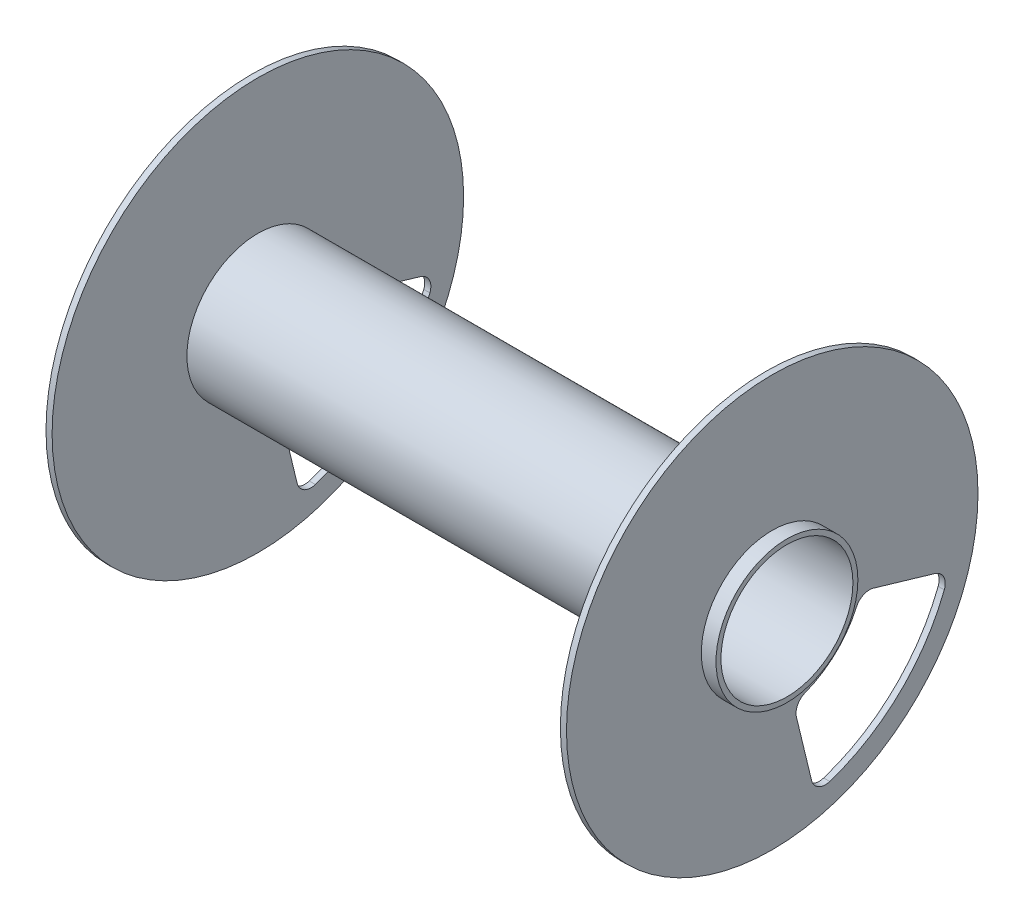
ISO-10303-21;
HEADER;
FILE_DESCRIPTION(('STEP AP214'),'2;1');
FILE_NAME('part.step','',(''),(''),'','','');
FILE_SCHEMA(('AUTOMOTIVE_DESIGN { 1 0 10303 214 1 1 1 1 }'));
ENDSEC;
DATA;
#1=APPLICATION_CONTEXT('core data for automotive mechanical design processes');
#2=APPLICATION_PROTOCOL_DEFINITION('international standard','automotive_design',2000,#1);
#3=PRODUCT_CONTEXT('',#1,'mechanical');
#4=PRODUCT('Part','Part','',(#3));
#5=PRODUCT_RELATED_PRODUCT_CATEGORY('part','',(#4));
#6=PRODUCT_DEFINITION_FORMATION('','',#4);
#7=PRODUCT_DEFINITION_CONTEXT('part definition',#1,'design');
#8=PRODUCT_DEFINITION('design','',#6,#7);
#9=PRODUCT_DEFINITION_SHAPE('','',#8);
#10=(LENGTH_UNIT() NAMED_UNIT(*) SI_UNIT(.MILLI.,.METRE.));
#11=(NAMED_UNIT(*) PLANE_ANGLE_UNIT() SI_UNIT($,.RADIAN.));
#12=(NAMED_UNIT(*) SI_UNIT($,.STERADIAN.) SOLID_ANGLE_UNIT());
#13=UNCERTAINTY_MEASURE_WITH_UNIT(LENGTH_MEASURE(1.E-05),#10,'distance_accuracy_value','');
#14=(GEOMETRIC_REPRESENTATION_CONTEXT(3) GLOBAL_UNCERTAINTY_ASSIGNED_CONTEXT((#13)) GLOBAL_UNIT_ASSIGNED_CONTEXT((#10,
#11,#12)) REPRESENTATION_CONTEXT('',''));
#15=CARTESIAN_POINT('',(0.,0.,0.));
#16=DIRECTION('',(0.,0.,1.));
#17=DIRECTION('',(1.,0.,0.));
#18=AXIS2_PLACEMENT_3D('',#15,#16,#17);
#19=CARTESIAN_POINT('',(0.,0.,0.));
#20=DIRECTION('',(1.,0.,0.));
#21=DIRECTION('',(0.,0.,-1.));
#22=AXIS2_PLACEMENT_3D('',#19,#20,#21);
#23=CYLINDRICAL_SURFACE('',#22,12.7);
#24=CARTESIAN_POINT('',(-52.3875,0.,0.));
#25=DIRECTION('',(1.,0.,0.));
#26=DIRECTION('',(0.,0.,-1.));
#27=AXIS2_PLACEMENT_3D('',#24,#25,#26);
#28=CIRCLE('',#27,12.7);
#29=CARTESIAN_POINT('',(-52.3875,0.,-12.7));
#30=VERTEX_POINT('',#29);
#31=EDGE_CURVE('E301',#30,#30,#28,.T.);
#32=ORIENTED_EDGE('',*,*,#31,.T.);
#33=EDGE_LOOP('',(#32));
#34=FACE_BOUND('',#33,.T.);
#35=CARTESIAN_POINT('',(-46.5836,0.,0.));
#36=DIRECTION('',(1.,0.,0.));
#37=DIRECTION('',(0.,0.,-1.));
#38=AXIS2_PLACEMENT_3D('',#35,#36,#37);
#39=CIRCLE('',#38,12.7);
#40=CARTESIAN_POINT('',(-46.5836,0.,-12.7));
#41=VERTEX_POINT('',#40);
#42=EDGE_CURVE('E241',#41,#41,#39,.T.);
#43=ORIENTED_EDGE('',*,*,#42,.F.);
#44=EDGE_LOOP('',(#43));
#45=FACE_BOUND('',#44,.T.);
#46=ADVANCED_FACE('F42',(#34,#45),#23,.T.);
#47=CARTESIAN_POINT('',(-52.3875,11.811,0.));
#48=DIRECTION('',(-1.,0.,0.));
#49=DIRECTION('',(0.,0.,1.));
#50=AXIS2_PLACEMENT_3D('',#47,#48,#49);
#51=PLANE('',#50);
#52=CARTESIAN_POINT('',(-52.3875,0.,0.));
#53=DIRECTION('',(1.,0.,0.));
#54=DIRECTION('',(0.,0.,-1.));
#55=AXIS2_PLACEMENT_3D('',#52,#53,#54);
#56=CIRCLE('',#55,11.811);
#57=CARTESIAN_POINT('',(-52.3875,0.,-11.811));
#58=VERTEX_POINT('',#57);
#59=EDGE_CURVE('E297',#58,#58,#56,.T.);
#60=ORIENTED_EDGE('',*,*,#59,.T.);
#61=EDGE_LOOP('',(#60));
#62=FACE_BOUND('',#61,.T.);
#63=ORIENTED_EDGE('',*,*,#31,.F.);
#64=EDGE_LOOP('',(#63));
#65=FACE_BOUND('',#64,.T.);
#66=ADVANCED_FACE('F443',(#62,#65),#51,.T.);
#67=CARTESIAN_POINT('',(0.,0.,0.));
#68=DIRECTION('',(1.,0.,0.));
#69=DIRECTION('',(0.,0.,-1.));
#70=AXIS2_PLACEMENT_3D('',#67,#68,#69);
#71=CYLINDRICAL_SURFACE('',#70,11.811);
#72=CARTESIAN_POINT('',(20.70735,0.,0.));
#73=DIRECTION('',(1.,0.,0.));
#74=DIRECTION('',(0.,0.,-1.));
#75=AXIS2_PLACEMENT_3D('',#72,#73,#74);
#76=CIRCLE('',#75,11.811);
#77=CARTESIAN_POINT('',(20.70735,0.,-11.811));
#78=VERTEX_POINT('',#77);
#79=EDGE_CURVE('E293',#78,#78,#76,.T.);
#80=ORIENTED_EDGE('',*,*,#79,.T.);
#81=EDGE_LOOP('',(#80));
#82=FACE_BOUND('',#81,.T.);
#83=ORIENTED_EDGE('',*,*,#59,.F.);
#84=EDGE_LOOP('',(#83));
#85=FACE_BOUND('',#84,.T.);
#86=ADVANCED_FACE('F448',(#82,#85),#71,.F.);
#87=CARTESIAN_POINT('',(20.70735,11.811,0.));
#88=DIRECTION('',(-1.,0.,0.));
#89=DIRECTION('',(0.,0.,1.));
#90=AXIS2_PLACEMENT_3D('',#87,#88,#89);
#91=PLANE('',#90);
#92=CARTESIAN_POINT('',(20.70735,0.,0.));
#93=DIRECTION('',(1.,0.,0.));
#94=DIRECTION('',(0.,0.,-1.));
#95=AXIS2_PLACEMENT_3D('',#92,#93,#94);
#96=CIRCLE('',#95,9.36625);
#97=CARTESIAN_POINT('',(20.70735,0.,-9.36625));
#98=VERTEX_POINT('',#97);
#99=EDGE_CURVE('E289',#98,#98,#96,.T.);
#100=ORIENTED_EDGE('',*,*,#99,.T.);
#101=EDGE_LOOP('',(#100));
#102=FACE_BOUND('',#101,.T.);
#103=ORIENTED_EDGE('',*,*,#79,.F.);
#104=EDGE_LOOP('',(#103));
#105=FACE_BOUND('',#104,.T.);
#106=ADVANCED_FACE('F515',(#102,#105),#91,.T.);
#107=CARTESIAN_POINT('',(0.,0.,0.));
#108=DIRECTION('',(1.,0.,0.));
#109=DIRECTION('',(0.,0.,-1.));
#110=AXIS2_PLACEMENT_3D('',#107,#108,#109);
#111=CYLINDRICAL_SURFACE('',#110,9.36625);
#112=CARTESIAN_POINT('',(26.91765,0.,0.));
#113=DIRECTION('',(1.,0.,0.));
#114=DIRECTION('',(0.,0.,-1.));
#115=AXIS2_PLACEMENT_3D('',#112,#113,#114);
#116=CIRCLE('',#115,9.36625);
#117=CARTESIAN_POINT('',(26.91765,0.,-9.36625));
#118=VERTEX_POINT('',#117);
#119=EDGE_CURVE('E285',#118,#118,#116,.T.);
#120=ORIENTED_EDGE('',*,*,#119,.T.);
#121=EDGE_LOOP('',(#120));
#122=FACE_BOUND('',#121,.T.);
#123=ORIENTED_EDGE('',*,*,#99,.F.);
#124=EDGE_LOOP('',(#123));
#125=FACE_BOUND('',#124,.T.);
#126=ADVANCED_FACE('F509',(#122,#125),#111,.F.);
#127=CARTESIAN_POINT('',(26.91765,9.36625,0.));
#128=DIRECTION('',(1.,0.,0.));
#129=DIRECTION('',(0.,0.,-1.));
#130=AXIS2_PLACEMENT_3D('',#127,#128,#129);
#131=PLANE('',#130);
#132=CARTESIAN_POINT('',(26.91765,0.,0.));
#133=DIRECTION('',(1.,0.,0.));
#134=DIRECTION('',(0.,0.,-1.));
#135=AXIS2_PLACEMENT_3D('',#132,#133,#134);
#136=CIRCLE('',#135,11.811);
#137=CARTESIAN_POINT('',(26.91765,0.,-11.811));
#138=VERTEX_POINT('',#137);
#139=EDGE_CURVE('E281',#138,#138,#136,.T.);
#140=ORIENTED_EDGE('',*,*,#139,.T.);
#141=EDGE_LOOP('',(#140));
#142=FACE_BOUND('',#141,.T.);
#143=ORIENTED_EDGE('',*,*,#119,.F.);
#144=EDGE_LOOP('',(#143));
#145=FACE_BOUND('',#144,.T.);
#146=ADVANCED_FACE('F503',(#142,#145),#131,.T.);
#147=CARTESIAN_POINT('',(0.,0.,0.));
#148=DIRECTION('',(1.,0.,0.));
#149=DIRECTION('',(0.,0.,-1.));
#150=AXIS2_PLACEMENT_3D('',#147,#148,#149);
#151=CYLINDRICAL_SURFACE('',#150,11.811);
#152=CARTESIAN_POINT('',(49.2125,0.,0.));
#153=DIRECTION('',(1.,0.,0.));
#154=DIRECTION('',(0.,0.,-1.));
#155=AXIS2_PLACEMENT_3D('',#152,#153,#154);
#156=CIRCLE('',#155,11.811);
#157=CARTESIAN_POINT('',(49.2125,0.,-11.811));
#158=VERTEX_POINT('',#157);
#159=EDGE_CURVE('E277',#158,#158,#156,.T.);
#160=ORIENTED_EDGE('',*,*,#159,.T.);
#161=EDGE_LOOP('',(#160));
#162=FACE_BOUND('',#161,.T.);
#163=ORIENTED_EDGE('',*,*,#139,.F.);
#164=EDGE_LOOP('',(#163));
#165=FACE_BOUND('',#164,.T.);
#166=ADVANCED_FACE('F497',(#162,#165),#151,.F.);
#167=CARTESIAN_POINT('',(49.2125,12.7,0.));
#168=DIRECTION('',(1.,0.,0.));
#169=DIRECTION('',(0.,0.,-1.));
#170=AXIS2_PLACEMENT_3D('',#167,#168,#169);
#171=PLANE('',#170);
#172=CARTESIAN_POINT('',(49.2125,0.,0.));
#173=DIRECTION('',(1.,0.,0.));
#174=DIRECTION('',(0.,0.,-1.));
#175=AXIS2_PLACEMENT_3D('',#172,#173,#174);
#176=CIRCLE('',#175,12.7);
#177=CARTESIAN_POINT('',(49.2125,0.,-12.7));
#178=VERTEX_POINT('',#177);
#179=EDGE_CURVE('E273',#178,#178,#176,.T.);
#180=ORIENTED_EDGE('',*,*,#179,.T.);
#181=EDGE_LOOP('',(#180));
#182=FACE_BOUND('',#181,.T.);
#183=ORIENTED_EDGE('',*,*,#159,.F.);
#184=EDGE_LOOP('',(#183));
#185=FACE_BOUND('',#184,.T.);
#186=ADVANCED_FACE('F491',(#182,#185),#171,.T.);
#187=CARTESIAN_POINT('',(0.,0.,0.));
#188=DIRECTION('',(1.,0.,0.));
#189=DIRECTION('',(0.,0.,-1.));
#190=AXIS2_PLACEMENT_3D('',#187,#188,#189);
#191=CYLINDRICAL_SURFACE('',#190,12.7);
#192=CARTESIAN_POINT('',(46.5836,0.,0.));
#193=DIRECTION('',(1.,0.,0.));
#194=DIRECTION('',(0.,0.,-1.));
#195=AXIS2_PLACEMENT_3D('',#192,#193,#194);
#196=CIRCLE('',#195,12.7);
#197=CARTESIAN_POINT('',(46.5836,0.,-12.7));
#198=VERTEX_POINT('',#197);
#199=EDGE_CURVE('E269',#198,#198,#196,.T.);
#200=ORIENTED_EDGE('',*,*,#199,.T.);
#201=EDGE_LOOP('',(#200));
#202=FACE_BOUND('',#201,.T.);
#203=ORIENTED_EDGE('',*,*,#179,.F.);
#204=EDGE_LOOP('',(#203));
#205=FACE_BOUND('',#204,.T.);
#206=ADVANCED_FACE('F485',(#202,#205),#191,.T.);
#207=CARTESIAN_POINT('',(46.5836,36.83,0.));
#208=DIRECTION('',(1.,0.,0.));
#209=DIRECTION('',(0.,0.,-1.));
#210=AXIS2_PLACEMENT_3D('',#207,#208,#209);
#211=PLANE('',#210);
#212=CARTESIAN_POINT('',(46.5836,0.,0.));
#213=DIRECTION('',(1.,0.,0.));
#214=DIRECTION('',(0.,0.,-1.));
#215=AXIS2_PLACEMENT_3D('',#212,#213,#214);
#216=CIRCLE('',#215,16.51);
#217=CARTESIAN_POINT('',(46.5836,-6.72822876170704,-15.0768377894749));
#218=VERTEX_POINT('',#217);
#219=CARTESIAN_POINT('',(46.5836,-15.4235043580943,-5.89029823657905));
#220=VERTEX_POINT('',#219);
#221=EDGE_CURVE('E238',#218,#220,#216,.F.);
#222=ORIENTED_EDGE('',*,*,#221,.F.);
#223=CARTESIAN_POINT('',(46.5836,-7.76334087889274,-17.3963512955479));
#224=DIRECTION('',(1.,0.,0.));
#225=DIRECTION('',(0.,0.,-1.));
#226=AXIS2_PLACEMENT_3D('',#223,#224,#225);
#227=CIRCLE('',#226,2.54);
#228=CARTESIAN_POINT('',(46.5836,-5.32652278049359,-18.1129526877559));
#229=VERTEX_POINT('',#228);
#230=EDGE_CURVE('E158',#229,#218,#227,.T.);
#231=ORIENTED_EDGE('',*,*,#230,.F.);
#232=DIRECTION('',(0.,0.282126532365325,0.959377204094155));
#233=VECTOR('',#232,1.);
#234=CARTESIAN_POINT('',(46.5836,2.9314978551409,9.96862008154307));
#235=LINE('',#234,#233);
#236=CARTESIAN_POINT('',(46.5836,-8.56930629689184,-29.1401062041656));
#237=VERTEX_POINT('',#236);
#238=EDGE_CURVE('E167',#237,#229,#235,.T.);
#239=ORIENTED_EDGE('',*,*,#238,.F.);
#240=CARTESIAN_POINT('',(46.5836,-11.006124395291,-28.4235048119577));
#241=DIRECTION('',(1.,0.,0.));
#242=DIRECTION('',(0.,0.,-1.));
#243=AXIS2_PLACEMENT_3D('',#240,#241,#242);
#244=CIRCLE('',#243,2.54);
#245=CARTESIAN_POINT('',(46.5836,-11.9233014282319,-30.7921302129541));
#246=VERTEX_POINT('',#245);
#247=EDGE_CURVE('E193',#246,#237,#244,.T.);
#248=ORIENTED_EDGE('',*,*,#247,.F.);
#249=CARTESIAN_POINT('',(46.5836,0.,0.));
#250=DIRECTION('',(1.,0.,0.));
#251=DIRECTION('',(0.,0.,-1.));
#252=AXIS2_PLACEMENT_3D('',#249,#250,#251);
#253=CIRCLE('',#252,33.02);
#254=CARTESIAN_POINT('',(46.5836,-31.3750727678852,-10.2919973187865));
#255=VERTEX_POINT('',#254);
#256=EDGE_CURVE('E202',#255,#246,#253,.T.);
#257=ORIENTED_EDGE('',*,*,#256,.F.);
#258=CARTESIAN_POINT('',(46.5836,-28.961605631894,-9.50030521734137));
#259=DIRECTION('',(1.,0.,0.));
#260=DIRECTION('',(0.,0.,-1.));
#261=AXIS2_PLACEMENT_3D('',#258,#259,#260);
#262=CIRCLE('',#261,2.54);
#263=CARTESIAN_POINT('',(46.5836,-29.5594196710542,-7.03165814362205));
#264=VERTEX_POINT('',#263);
#265=EDGE_CURVE('E211',#264,#255,#262,.T.);
#266=ORIENTED_EDGE('',*,*,#265,.F.);
#267=DIRECTION('',(0.,-0.971908296739889,-0.235359857937091));
#268=VECTOR('',#267,1.);
#269=CARTESIAN_POINT('',(46.5836,34.7608861782372,8.54431553407868));
#270=LINE('',#269,#268);
#271=CARTESIAN_POINT('',(46.5836,-18.3941652215767,-4.3278508915642));
#272=VERTEX_POINT('',#271);
#273=EDGE_CURVE('E220',#272,#264,#270,.T.);
#274=ORIENTED_EDGE('',*,*,#273,.F.);
#275=CARTESIAN_POINT('',(46.5836,-17.7963511824165,-6.79649796528352));
#276=DIRECTION('',(1.,0.,0.));
#277=DIRECTION('',(0.,0.,-1.));
#278=AXIS2_PLACEMENT_3D('',#275,#276,#277);
#279=CIRCLE('',#278,2.54);
#280=EDGE_CURVE('E229',#220,#272,#279,.T.);
#281=ORIENTED_EDGE('',*,*,#280,.F.);
#282=EDGE_LOOP('',(#222,#231,#239,#248,#257,#266,#274,#281));
#283=FACE_BOUND('',#282,.T.);
#284=CARTESIAN_POINT('',(46.5836,0.,0.));
#285=DIRECTION('',(1.,0.,0.));
#286=DIRECTION('',(0.,0.,-1.));
#287=AXIS2_PLACEMENT_3D('',#284,#285,#286);
#288=CIRCLE('',#287,36.83);
#289=CARTESIAN_POINT('',(46.5836,0.,-36.83));
#290=VERTEX_POINT('',#289);
#291=EDGE_CURVE('E265',#290,#290,#288,.T.);
#292=ORIENTED_EDGE('',*,*,#291,.T.);
#293=EDGE_LOOP('',(#292));
#294=FACE_BOUND('',#293,.T.);
#295=ORIENTED_EDGE('',*,*,#199,.F.);
#296=EDGE_LOOP('',(#295));
#297=FACE_BOUND('',#296,.T.);
#298=ADVANCED_FACE('F375',(#283,#294,#297),#211,.T.);
#299=CARTESIAN_POINT('',(0.,0.,0.));
#300=DIRECTION('',(1.,0.,0.));
#301=DIRECTION('',(0.,0.,-1.));
#302=AXIS2_PLACEMENT_3D('',#299,#300,#301);
#303=CYLINDRICAL_SURFACE('',#302,36.83);
#304=CARTESIAN_POINT('',(45.4914,0.,0.));
#305=DIRECTION('',(1.,0.,0.));
#306=DIRECTION('',(0.,0.,-1.));
#307=AXIS2_PLACEMENT_3D('',#304,#305,#306);
#308=CIRCLE('',#307,36.83);
#309=CARTESIAN_POINT('',(45.4914,0.,-36.83));
#310=VERTEX_POINT('',#309);
#311=EDGE_CURVE('E261',#310,#310,#308,.T.);
#312=ORIENTED_EDGE('',*,*,#311,.T.);
#313=EDGE_LOOP('',(#312));
#314=FACE_BOUND('',#313,.T.);
#315=ORIENTED_EDGE('',*,*,#291,.F.);
#316=EDGE_LOOP('',(#315));
#317=FACE_BOUND('',#316,.T.);
#318=ADVANCED_FACE('F475',(#314,#317),#303,.T.);
#319=CARTESIAN_POINT('',(45.4914,12.7,0.));
#320=DIRECTION('',(-1.,0.,0.));
#321=DIRECTION('',(0.,0.,1.));
#322=AXIS2_PLACEMENT_3D('',#319,#320,#321);
#323=PLANE('',#322);
#324=CARTESIAN_POINT('',(45.4914,0.,0.));
#325=DIRECTION('',(-1.,0.,0.));
#326=DIRECTION('',(0.,0.,1.));
#327=AXIS2_PLACEMENT_3D('',#324,#325,#326);
#328=CIRCLE('',#327,16.51);
#329=CARTESIAN_POINT('',(45.4914,-15.4235043580943,-5.89029823657905));
#330=VERTEX_POINT('',#329);
#331=CARTESIAN_POINT('',(45.4914,-6.72822876170704,-15.0768377894749));
#332=VERTEX_POINT('',#331);
#333=EDGE_CURVE('E235',#330,#332,#328,.F.);
#334=ORIENTED_EDGE('',*,*,#333,.F.);
#335=CARTESIAN_POINT('',(45.4914,-17.7963511824165,-6.79649796528352));
#336=DIRECTION('',(-1.,0.,0.));
#337=DIRECTION('',(0.,0.,1.));
#338=AXIS2_PLACEMENT_3D('',#335,#336,#337);
#339=CIRCLE('',#338,2.54);
#340=CARTESIAN_POINT('',(45.4914,-18.3941652215767,-4.3278508915642));
#341=VERTEX_POINT('',#340);
#342=EDGE_CURVE('E226',#341,#330,#339,.T.);
#343=ORIENTED_EDGE('',*,*,#342,.F.);
#344=DIRECTION('',(0.,0.971908296739889,0.235359857937091));
#345=VECTOR('',#344,1.);
#346=CARTESIAN_POINT('',(45.4914,11.9675497378679,3.02462150068844));
#347=LINE('',#346,#345);
#348=CARTESIAN_POINT('',(45.4914,-29.5594196710542,-7.03165814362205));
#349=VERTEX_POINT('',#348);
#350=EDGE_CURVE('E217',#349,#341,#347,.T.);
#351=ORIENTED_EDGE('',*,*,#350,.F.);
#352=CARTESIAN_POINT('',(45.4914,-28.961605631894,-9.50030521734137));
#353=DIRECTION('',(-1.,0.,0.));
#354=DIRECTION('',(0.,0.,1.));
#355=AXIS2_PLACEMENT_3D('',#352,#353,#354);
#356=CIRCLE('',#355,2.54);
#357=CARTESIAN_POINT('',(45.4914,-31.3750727678852,-10.2919973187865));
#358=VERTEX_POINT('',#357);
#359=EDGE_CURVE('E208',#358,#349,#356,.T.);
#360=ORIENTED_EDGE('',*,*,#359,.F.);
#361=CARTESIAN_POINT('',(45.4914,0.,0.));
#362=DIRECTION('',(-1.,0.,0.));
#363=DIRECTION('',(0.,0.,1.));
#364=AXIS2_PLACEMENT_3D('',#361,#362,#363);
#365=CIRCLE('',#364,33.02);
#366=CARTESIAN_POINT('',(45.4914,-11.9233014282319,-30.7921302129541));
#367=VERTEX_POINT('',#366);
#368=EDGE_CURVE('E199',#367,#358,#365,.T.);
#369=ORIENTED_EDGE('',*,*,#368,.F.);
#370=CARTESIAN_POINT('',(45.4914,-11.006124395291,-28.4235048119577));
#371=DIRECTION('',(-1.,0.,0.));
#372=DIRECTION('',(0.,0.,1.));
#373=AXIS2_PLACEMENT_3D('',#370,#371,#372);
#374=CIRCLE('',#373,2.54);
#375=CARTESIAN_POINT('',(45.4914,-8.56930629689184,-29.1401062041656));
#376=VERTEX_POINT('',#375);
#377=EDGE_CURVE('E177',#376,#367,#374,.T.);
#378=ORIENTED_EDGE('',*,*,#377,.F.);
#379=DIRECTION('',(0.,-0.282126532365325,-0.959377204094155));
#380=VECTOR('',#379,1.);
#381=CARTESIAN_POINT('',(45.4914,1.01086132935893,3.43745520053209));
#382=LINE('',#381,#380);
#383=CARTESIAN_POINT('',(45.4914,-5.32652278049359,-18.1129526877559));
#384=VERTEX_POINT('',#383);
#385=EDGE_CURVE('E164',#384,#376,#382,.T.);
#386=ORIENTED_EDGE('',*,*,#385,.F.);
#387=CARTESIAN_POINT('',(45.4914,-7.76334087889274,-17.3963512955479));
#388=DIRECTION('',(-1.,0.,0.));
#389=DIRECTION('',(0.,0.,1.));
#390=AXIS2_PLACEMENT_3D('',#387,#388,#389);
#391=CIRCLE('',#390,2.54);
#392=EDGE_CURVE('E152',#332,#384,#391,.T.);
#393=ORIENTED_EDGE('',*,*,#392,.F.);
#394=EDGE_LOOP('',(#334,#343,#351,#360,#369,#378,#386,#393));
#395=FACE_BOUND('',#394,.T.);
#396=CARTESIAN_POINT('',(45.4914,0.,0.));
#397=DIRECTION('',(1.,0.,0.));
#398=DIRECTION('',(0.,0.,-1.));
#399=AXIS2_PLACEMENT_3D('',#396,#397,#398);
#400=CIRCLE('',#399,12.7);
#401=CARTESIAN_POINT('',(45.4914,0.,-12.7));
#402=VERTEX_POINT('',#401);
#403=EDGE_CURVE('E257',#402,#402,#400,.T.);
#404=ORIENTED_EDGE('',*,*,#403,.T.);
#405=EDGE_LOOP('',(#404));
#406=FACE_BOUND('',#405,.T.);
#407=ORIENTED_EDGE('',*,*,#311,.F.);
#408=EDGE_LOOP('',(#407));
#409=FACE_BOUND('',#408,.T.);
#410=ADVANCED_FACE('F174',(#395,#406,#409),#323,.T.);
#411=CARTESIAN_POINT('',(0.,0.,0.));
#412=DIRECTION('',(1.,0.,0.));
#413=DIRECTION('',(0.,0.,-1.));
#414=AXIS2_PLACEMENT_3D('',#411,#412,#413);
#415=CYLINDRICAL_SURFACE('',#414,12.7);
#416=CARTESIAN_POINT('',(-45.4914,0.,0.));
#417=DIRECTION('',(1.,0.,0.));
#418=DIRECTION('',(0.,0.,-1.));
#419=AXIS2_PLACEMENT_3D('',#416,#417,#418);
#420=CIRCLE('',#419,12.7);
#421=CARTESIAN_POINT('',(-45.4914,0.,-12.7));
#422=VERTEX_POINT('',#421);
#423=EDGE_CURVE('E253',#422,#422,#420,.T.);
#424=ORIENTED_EDGE('',*,*,#423,.T.);
#425=EDGE_LOOP('',(#424));
#426=FACE_BOUND('',#425,.T.);
#427=ORIENTED_EDGE('',*,*,#403,.F.);
#428=EDGE_LOOP('',(#427));
#429=FACE_BOUND('',#428,.T.);
#430=ADVANCED_FACE('F465',(#426,#429),#415,.T.);
#431=CARTESIAN_POINT('',(-45.4914,36.83,0.));
#432=DIRECTION('',(1.,0.,0.));
#433=DIRECTION('',(0.,0.,-1.));
#434=AXIS2_PLACEMENT_3D('',#431,#432,#433);
#435=PLANE('',#434);
#436=CARTESIAN_POINT('',(-45.4914,0.,0.));
#437=DIRECTION('',(1.,0.,0.));
#438=DIRECTION('',(0.,0.,-1.));
#439=AXIS2_PLACEMENT_3D('',#436,#437,#438);
#440=CIRCLE('',#439,16.51);
#441=CARTESIAN_POINT('',(-45.4914,-6.72822876170704,-15.0768377894749));
#442=VERTEX_POINT('',#441);
#443=CARTESIAN_POINT('',(-45.4914,-15.4235043580943,-5.89029823657905));
#444=VERTEX_POINT('',#443);
#445=EDGE_CURVE('E232',#442,#444,#440,.F.);
#446=ORIENTED_EDGE('',*,*,#445,.F.);
#447=CARTESIAN_POINT('',(-45.4914,-7.76334087889274,-17.3963512955479));
#448=DIRECTION('',(1.,0.,0.));
#449=DIRECTION('',(0.,0.,-1.));
#450=AXIS2_PLACEMENT_3D('',#447,#448,#449);
#451=CIRCLE('',#450,2.54);
#452=CARTESIAN_POINT('',(-45.4914,-5.32652278049359,-18.1129526877559));
#453=VERTEX_POINT('',#452);
#454=EDGE_CURVE('E159',#453,#442,#451,.T.);
#455=ORIENTED_EDGE('',*,*,#454,.F.);
#456=DIRECTION('',(0.,0.282126532365325,0.959377204094155));
#457=VECTOR('',#456,1.);
#458=CARTESIAN_POINT('',(-45.4914,2.9314978551409,9.96862008154307));
#459=LINE('',#458,#457);
#460=CARTESIAN_POINT('',(-45.4914,-8.56930629689184,-29.1401062041656));
#461=VERTEX_POINT('',#460);
#462=EDGE_CURVE('E179',#461,#453,#459,.T.);
#463=ORIENTED_EDGE('',*,*,#462,.F.);
#464=CARTESIAN_POINT('',(-45.4914,-11.006124395291,-28.4235048119577));
#465=DIRECTION('',(1.,0.,0.));
#466=DIRECTION('',(0.,0.,-1.));
#467=AXIS2_PLACEMENT_3D('',#464,#465,#466);
#468=CIRCLE('',#467,2.54);
#469=CARTESIAN_POINT('',(-45.4914,-11.9233014282319,-30.7921302129541));
#470=VERTEX_POINT('',#469);
#471=EDGE_CURVE('E183',#470,#461,#468,.T.);
#472=ORIENTED_EDGE('',*,*,#471,.F.);
#473=CARTESIAN_POINT('',(-45.4914,0.,0.));
#474=DIRECTION('',(1.,0.,0.));
#475=DIRECTION('',(0.,0.,-1.));
#476=AXIS2_PLACEMENT_3D('',#473,#474,#475);
#477=CIRCLE('',#476,33.02);
#478=CARTESIAN_POINT('',(-45.4914,-31.3750727678852,-10.2919973187865));
#479=VERTEX_POINT('',#478);
#480=EDGE_CURVE('E196',#479,#470,#477,.T.);
#481=ORIENTED_EDGE('',*,*,#480,.F.);
#482=CARTESIAN_POINT('',(-45.4914,-28.961605631894,-9.50030521734137));
#483=DIRECTION('',(1.,0.,0.));
#484=DIRECTION('',(0.,0.,-1.));
#485=AXIS2_PLACEMENT_3D('',#482,#483,#484);
#486=CIRCLE('',#485,2.54);
#487=CARTESIAN_POINT('',(-45.4914,-29.5594196710542,-7.03165814362205));
#488=VERTEX_POINT('',#487);
#489=EDGE_CURVE('E205',#488,#479,#486,.T.);
#490=ORIENTED_EDGE('',*,*,#489,.F.);
#491=DIRECTION('',(0.,-0.971908296739889,-0.235359857937091));
#492=VECTOR('',#491,1.);
#493=CARTESIAN_POINT('',(-45.4914,34.7608861782372,8.54431553407868));
#494=LINE('',#493,#492);
#495=CARTESIAN_POINT('',(-45.4914,-18.3941652215767,-4.3278508915642));
#496=VERTEX_POINT('',#495);
#497=EDGE_CURVE('E214',#496,#488,#494,.T.);
#498=ORIENTED_EDGE('',*,*,#497,.F.);
#499=CARTESIAN_POINT('',(-45.4914,-17.7963511824165,-6.79649796528352));
#500=DIRECTION('',(1.,0.,0.));
#501=DIRECTION('',(0.,0.,-1.));
#502=AXIS2_PLACEMENT_3D('',#499,#500,#501);
#503=CIRCLE('',#502,2.54);
#504=EDGE_CURVE('E223',#444,#496,#503,.T.);
#505=ORIENTED_EDGE('',*,*,#504,.F.);
#506=EDGE_LOOP('',(#446,#455,#463,#472,#481,#490,#498,#505));
#507=FACE_BOUND('',#506,.T.);
#508=CARTESIAN_POINT('',(-45.4914,0.,0.));
#509=DIRECTION('',(1.,0.,0.));
#510=DIRECTION('',(0.,0.,-1.));
#511=AXIS2_PLACEMENT_3D('',#508,#509,#510);
#512=CIRCLE('',#511,36.83);
#513=CARTESIAN_POINT('',(-45.4914,0.,-36.83));
#514=VERTEX_POINT('',#513);
#515=EDGE_CURVE('E249',#514,#514,#512,.T.);
#516=ORIENTED_EDGE('',*,*,#515,.T.);
#517=EDGE_LOOP('',(#516));
#518=FACE_BOUND('',#517,.T.);
#519=ORIENTED_EDGE('',*,*,#423,.F.);
#520=EDGE_LOOP('',(#519));
#521=FACE_BOUND('',#520,.T.);
#522=ADVANCED_FACE('F428',(#507,#518,#521),#435,.T.);
#523=CARTESIAN_POINT('',(0.,0.,0.));
#524=DIRECTION('',(1.,0.,0.));
#525=DIRECTION('',(0.,0.,-1.));
#526=AXIS2_PLACEMENT_3D('',#523,#524,#525);
#527=CYLINDRICAL_SURFACE('',#526,36.83);
#528=CARTESIAN_POINT('',(-46.5836,0.,0.));
#529=DIRECTION('',(1.,0.,0.));
#530=DIRECTION('',(0.,0.,-1.));
#531=AXIS2_PLACEMENT_3D('',#528,#529,#530);
#532=CIRCLE('',#531,36.83);
#533=CARTESIAN_POINT('',(-46.5836,0.,-36.83));
#534=VERTEX_POINT('',#533);
#535=EDGE_CURVE('E245',#534,#534,#532,.T.);
#536=ORIENTED_EDGE('',*,*,#535,.T.);
#537=EDGE_LOOP('',(#536));
#538=FACE_BOUND('',#537,.T.);
#539=ORIENTED_EDGE('',*,*,#515,.F.);
#540=EDGE_LOOP('',(#539));
#541=FACE_BOUND('',#540,.T.);
#542=ADVANCED_FACE('F455',(#538,#541),#527,.T.);
#543=CARTESIAN_POINT('',(-46.5836,12.7,0.));
#544=DIRECTION('',(-1.,0.,0.));
#545=DIRECTION('',(0.,0.,1.));
#546=AXIS2_PLACEMENT_3D('',#543,#544,#545);
#547=PLANE('',#546);
#548=CARTESIAN_POINT('',(-46.5836,0.,0.));
#549=DIRECTION('',(-1.,0.,0.));
#550=DIRECTION('',(0.,0.,1.));
#551=AXIS2_PLACEMENT_3D('',#548,#549,#550);
#552=CIRCLE('',#551,16.51);
#553=CARTESIAN_POINT('',(-46.5836,-15.4235043580943,-5.89029823657905));
#554=VERTEX_POINT('',#553);
#555=CARTESIAN_POINT('',(-46.5836,-6.72822876170704,-15.0768377894749));
#556=VERTEX_POINT('',#555);
#557=EDGE_CURVE('E11',#554,#556,#552,.F.);
#558=ORIENTED_EDGE('',*,*,#557,.F.);
#559=CARTESIAN_POINT('',(-46.5836,-17.7963511824165,-6.79649796528352));
#560=DIRECTION('',(-1.,0.,0.));
#561=DIRECTION('',(0.,0.,1.));
#562=AXIS2_PLACEMENT_3D('',#559,#560,#561);
#563=CIRCLE('',#562,2.54);
#564=CARTESIAN_POINT('',(-46.5836,-18.3941652215767,-4.3278508915642));
#565=VERTEX_POINT('',#564);
#566=EDGE_CURVE('E50',#565,#554,#563,.T.);
#567=ORIENTED_EDGE('',*,*,#566,.F.);
#568=DIRECTION('',(0.,0.971908296739889,0.235359857937091));
#569=VECTOR('',#568,1.);
#570=CARTESIAN_POINT('',(-46.5836,11.9675497378679,3.02462150068844));
#571=LINE('',#570,#569);
#572=CARTESIAN_POINT('',(-46.5836,-29.5594196710542,-7.03165814362205));
#573=VERTEX_POINT('',#572);
#574=EDGE_CURVE('E320',#573,#565,#571,.T.);
#575=ORIENTED_EDGE('',*,*,#574,.F.);
#576=CARTESIAN_POINT('',(-46.5836,-28.961605631894,-9.50030521734137));
#577=DIRECTION('',(-1.,0.,0.));
#578=DIRECTION('',(0.,0.,1.));
#579=AXIS2_PLACEMENT_3D('',#576,#577,#578);
#580=CIRCLE('',#579,2.54);
#581=CARTESIAN_POINT('',(-46.5836,-31.3750727678852,-10.2919973187865));
#582=VERTEX_POINT('',#581);
#583=EDGE_CURVE('E317',#582,#573,#580,.T.);
#584=ORIENTED_EDGE('',*,*,#583,.F.);
#585=CARTESIAN_POINT('',(-46.5836,0.,0.));
#586=DIRECTION('',(-1.,0.,0.));
#587=DIRECTION('',(0.,0.,1.));
#588=AXIS2_PLACEMENT_3D('',#585,#586,#587);
#589=CIRCLE('',#588,33.02);
#590=CARTESIAN_POINT('',(-46.5836,-11.9233014282319,-30.7921302129541));
#591=VERTEX_POINT('',#590);
#592=EDGE_CURVE('E314',#591,#582,#589,.T.);
#593=ORIENTED_EDGE('',*,*,#592,.F.);
#594=CARTESIAN_POINT('',(-46.5836,-11.006124395291,-28.4235048119577));
#595=DIRECTION('',(-1.,0.,0.));
#596=DIRECTION('',(0.,0.,1.));
#597=AXIS2_PLACEMENT_3D('',#594,#595,#596);
#598=CIRCLE('',#597,2.54);
#599=CARTESIAN_POINT('',(-46.5836,-8.56930629689184,-29.1401062041656));
#600=VERTEX_POINT('',#599);
#601=EDGE_CURVE('E311',#600,#591,#598,.T.);
#602=ORIENTED_EDGE('',*,*,#601,.F.);
#603=DIRECTION('',(0.,-0.282126532365325,-0.959377204094155));
#604=VECTOR('',#603,1.);
#605=CARTESIAN_POINT('',(-46.5836,1.01086132935893,3.43745520053209));
#606=LINE('',#605,#604);
#607=CARTESIAN_POINT('',(-46.5836,-5.32652278049359,-18.1129526877559));
#608=VERTEX_POINT('',#607);
#609=EDGE_CURVE('E308',#608,#600,#606,.T.);
#610=ORIENTED_EDGE('',*,*,#609,.F.);
#611=CARTESIAN_POINT('',(-46.5836,-7.76334087889274,-17.3963512955479));
#612=DIRECTION('',(-1.,0.,0.));
#613=DIRECTION('',(0.,0.,1.));
#614=AXIS2_PLACEMENT_3D('',#611,#612,#613);
#615=CIRCLE('',#614,2.54);
#616=EDGE_CURVE('E305',#556,#608,#615,.T.);
#617=ORIENTED_EDGE('',*,*,#616,.F.);
#618=EDGE_LOOP('',(#558,#567,#575,#584,#593,#602,#610,#617));
#619=FACE_BOUND('',#618,.T.);
#620=ORIENTED_EDGE('',*,*,#42,.T.);
#621=EDGE_LOOP('',(#620));
#622=FACE_BOUND('',#621,.T.);
#623=ORIENTED_EDGE('',*,*,#535,.F.);
#624=EDGE_LOOP('',(#623));
#625=FACE_BOUND('',#624,.T.);
#626=ADVANCED_FACE('F345',(#619,#622,#625),#547,.T.);
#627=CARTESIAN_POINT('',(49.2125,-7.76334087889274,-17.3963512955479));
#628=DIRECTION('',(-1.,0.,0.));
#629=DIRECTION('',(0.,0.,1.));
#630=AXIS2_PLACEMENT_3D('',#627,#628,#629);
#631=CYLINDRICAL_SURFACE('',#630,2.54);
#632=ORIENTED_EDGE('',*,*,#454,.T.);
#633=DIRECTION('',(-1.,0.,0.));
#634=VECTOR('',#633,1.);
#635=CARTESIAN_POINT('',(49.2125,-6.72822876170704,-15.0768377894749));
#636=LINE('',#635,#634);
#637=EDGE_CURVE('E352',#442,#556,#636,.T.);
#638=ORIENTED_EDGE('',*,*,#637,.T.);
#639=ORIENTED_EDGE('',*,*,#616,.T.);
#640=DIRECTION('',(-1.,0.,0.));
#641=VECTOR('',#640,1.);
#642=CARTESIAN_POINT('',(49.2125,-5.32652278049359,-18.1129526877559));
#643=LINE('',#642,#641);
#644=EDGE_CURVE('E171',#453,#608,#643,.T.);
#645=ORIENTED_EDGE('',*,*,#644,.F.);
#646=EDGE_LOOP('',(#632,#638,#639,#645));
#647=FACE_BOUND('',#646,.T.);
#648=ADVANCED_FACE('F351',(#647),#631,.F.);
#649=CARTESIAN_POINT('',(49.2125,-5.32652278049359,-18.1129526877559));
#650=DIRECTION('',(0.,0.959377204094155,-0.282126532365325));
#651=DIRECTION('',(0.,0.282126532365325,0.959377204094155));
#652=AXIS2_PLACEMENT_3D('',#649,#650,#651);
#653=PLANE('',#652);
#654=ORIENTED_EDGE('',*,*,#462,.T.);
#655=ORIENTED_EDGE('',*,*,#644,.T.);
#656=ORIENTED_EDGE('',*,*,#609,.T.);
#657=DIRECTION('',(-1.,0.,0.));
#658=VECTOR('',#657,1.);
#659=CARTESIAN_POINT('',(49.2125,-8.56930629689184,-29.1401062041656));
#660=LINE('',#659,#658);
#661=EDGE_CURVE('E170',#461,#600,#660,.T.);
#662=ORIENTED_EDGE('',*,*,#661,.F.);
#663=EDGE_LOOP('',(#654,#655,#656,#662));
#664=FACE_BOUND('',#663,.T.);
#665=ADVANCED_FACE('F354',(#664),#653,.F.);
#666=CARTESIAN_POINT('',(49.2125,-11.006124395291,-28.4235048119577));
#667=DIRECTION('',(-1.,0.,0.));
#668=DIRECTION('',(0.,0.,1.));
#669=AXIS2_PLACEMENT_3D('',#666,#667,#668);
#670=CYLINDRICAL_SURFACE('',#669,2.54);
#671=ORIENTED_EDGE('',*,*,#471,.T.);
#672=ORIENTED_EDGE('',*,*,#661,.T.);
#673=ORIENTED_EDGE('',*,*,#601,.T.);
#674=DIRECTION('',(-1.,0.,0.));
#675=VECTOR('',#674,1.);
#676=CARTESIAN_POINT('',(49.2125,-11.9233014282319,-30.7921302129541));
#677=LINE('',#676,#675);
#678=EDGE_CURVE('E403',#470,#591,#677,.T.);
#679=ORIENTED_EDGE('',*,*,#678,.F.);
#680=EDGE_LOOP('',(#671,#672,#673,#679));
#681=FACE_BOUND('',#680,.T.);
#682=ADVANCED_FACE('F416',(#681),#670,.F.);
#683=CARTESIAN_POINT('',(49.2125,0.,0.));
#684=DIRECTION('',(-1.,0.,0.));
#685=DIRECTION('',(0.,0.,1.));
#686=AXIS2_PLACEMENT_3D('',#683,#684,#685);
#687=CYLINDRICAL_SURFACE('',#686,33.02);
#688=ORIENTED_EDGE('',*,*,#480,.T.);
#689=ORIENTED_EDGE('',*,*,#678,.T.);
#690=ORIENTED_EDGE('',*,*,#592,.T.);
#691=DIRECTION('',(-1.,0.,0.));
#692=VECTOR('',#691,1.);
#693=CARTESIAN_POINT('',(49.2125,-31.3750727678852,-10.2919973187865));
#694=LINE('',#693,#692);
#695=EDGE_CURVE('E399',#479,#582,#694,.T.);
#696=ORIENTED_EDGE('',*,*,#695,.F.);
#697=EDGE_LOOP('',(#688,#689,#690,#696));
#698=FACE_BOUND('',#697,.T.);
#699=ADVANCED_FACE('F420',(#698),#687,.F.);
#700=CARTESIAN_POINT('',(49.2125,-28.961605631894,-9.50030521734137));
#701=DIRECTION('',(-1.,0.,0.));
#702=DIRECTION('',(0.,0.,1.));
#703=AXIS2_PLACEMENT_3D('',#700,#701,#702);
#704=CYLINDRICAL_SURFACE('',#703,2.54);
#705=ORIENTED_EDGE('',*,*,#489,.T.);
#706=ORIENTED_EDGE('',*,*,#695,.T.);
#707=ORIENTED_EDGE('',*,*,#583,.T.);
#708=DIRECTION('',(-1.,0.,0.));
#709=VECTOR('',#708,1.);
#710=CARTESIAN_POINT('',(49.2125,-29.5594196710542,-7.03165814362205));
#711=LINE('',#710,#709);
#712=EDGE_CURVE('E394',#488,#573,#711,.T.);
#713=ORIENTED_EDGE('',*,*,#712,.F.);
#714=EDGE_LOOP('',(#705,#706,#707,#713));
#715=FACE_BOUND('',#714,.T.);
#716=ADVANCED_FACE('F423',(#715),#704,.F.);
#717=CARTESIAN_POINT('',(49.2125,-18.3941652215767,-4.3278508915642));
#718=DIRECTION('',(0.,-0.235359857937091,0.971908296739889));
#719=DIRECTION('',(0.,-0.971908296739889,-0.235359857937091));
#720=AXIS2_PLACEMENT_3D('',#717,#718,#719);
#721=PLANE('',#720);
#722=ORIENTED_EDGE('',*,*,#497,.T.);
#723=ORIENTED_EDGE('',*,*,#712,.T.);
#724=ORIENTED_EDGE('',*,*,#574,.T.);
#725=DIRECTION('',(-1.,0.,0.));
#726=VECTOR('',#725,1.);
#727=CARTESIAN_POINT('',(49.2125,-18.3941652215767,-4.3278508915642));
#728=LINE('',#727,#726);
#729=EDGE_CURVE('E332',#496,#565,#728,.T.);
#730=ORIENTED_EDGE('',*,*,#729,.F.);
#731=EDGE_LOOP('',(#722,#723,#724,#730));
#732=FACE_BOUND('',#731,.T.);
#733=ADVANCED_FACE('F431',(#732),#721,.F.);
#734=CARTESIAN_POINT('',(49.2125,-17.7963511824165,-6.79649796528352));
#735=DIRECTION('',(-1.,0.,0.));
#736=DIRECTION('',(0.,0.,1.));
#737=AXIS2_PLACEMENT_3D('',#734,#735,#736);
#738=CYLINDRICAL_SURFACE('',#737,2.54);
#739=ORIENTED_EDGE('',*,*,#504,.T.);
#740=ORIENTED_EDGE('',*,*,#729,.T.);
#741=ORIENTED_EDGE('',*,*,#566,.T.);
#742=DIRECTION('',(-1.,0.,0.));
#743=VECTOR('',#742,1.);
#744=CARTESIAN_POINT('',(49.2125,-15.4235043580943,-5.89029823657905));
#745=LINE('',#744,#743);
#746=EDGE_CURVE('E329',#444,#554,#745,.T.);
#747=ORIENTED_EDGE('',*,*,#746,.F.);
#748=EDGE_LOOP('',(#739,#740,#741,#747));
#749=FACE_BOUND('',#748,.T.);
#750=ADVANCED_FACE('F328',(#749),#738,.F.);
#751=CARTESIAN_POINT('',(49.2125,0.,0.));
#752=DIRECTION('',(-1.,0.,0.));
#753=DIRECTION('',(0.,0.,1.));
#754=AXIS2_PLACEMENT_3D('',#751,#752,#753);
#755=CYLINDRICAL_SURFACE('',#754,16.51);
#756=ORIENTED_EDGE('',*,*,#445,.T.);
#757=ORIENTED_EDGE('',*,*,#746,.T.);
#758=ORIENTED_EDGE('',*,*,#557,.T.);
#759=ORIENTED_EDGE('',*,*,#637,.F.);
#760=EDGE_LOOP('',(#756,#757,#758,#759));
#761=FACE_BOUND('',#760,.T.);
#762=ADVANCED_FACE('F337',(#761),#755,.T.);
#763=ORIENTED_EDGE('',*,*,#221,.T.);
#764=EDGE_CURVE('E342',#220,#330,#745,.T.);
#765=ORIENTED_EDGE('',*,*,#764,.T.);
#766=ORIENTED_EDGE('',*,*,#333,.T.);
#767=EDGE_CURVE('E62',#218,#332,#636,.T.);
#768=ORIENTED_EDGE('',*,*,#767,.F.);
#769=EDGE_LOOP('',(#763,#765,#766,#768));
#770=FACE_BOUND('',#769,.T.);
#771=ADVANCED_FACE('F371',(#770),#755,.T.);
#772=ORIENTED_EDGE('',*,*,#280,.T.);
#773=EDGE_CURVE('E343',#272,#341,#728,.T.);
#774=ORIENTED_EDGE('',*,*,#773,.T.);
#775=ORIENTED_EDGE('',*,*,#342,.T.);
#776=ORIENTED_EDGE('',*,*,#764,.F.);
#777=EDGE_LOOP('',(#772,#774,#775,#776));
#778=FACE_BOUND('',#777,.T.);
#779=ADVANCED_FACE('F382',(#778),#738,.F.);
#780=ORIENTED_EDGE('',*,*,#273,.T.);
#781=EDGE_CURVE('E392',#264,#349,#711,.T.);
#782=ORIENTED_EDGE('',*,*,#781,.T.);
#783=ORIENTED_EDGE('',*,*,#350,.T.);
#784=ORIENTED_EDGE('',*,*,#773,.F.);
#785=EDGE_LOOP('',(#780,#782,#783,#784));
#786=FACE_BOUND('',#785,.T.);
#787=ADVANCED_FACE('F385',(#786),#721,.F.);
#788=ORIENTED_EDGE('',*,*,#265,.T.);
#789=EDGE_CURVE('E398',#255,#358,#694,.T.);
#790=ORIENTED_EDGE('',*,*,#789,.T.);
#791=ORIENTED_EDGE('',*,*,#359,.T.);
#792=ORIENTED_EDGE('',*,*,#781,.F.);
#793=EDGE_LOOP('',(#788,#790,#791,#792));
#794=FACE_BOUND('',#793,.T.);
#795=ADVANCED_FACE('F440',(#794),#704,.F.);
#796=ORIENTED_EDGE('',*,*,#256,.T.);
#797=EDGE_CURVE('E402',#246,#367,#677,.T.);
#798=ORIENTED_EDGE('',*,*,#797,.T.);
#799=ORIENTED_EDGE('',*,*,#368,.T.);
#800=ORIENTED_EDGE('',*,*,#789,.F.);
#801=EDGE_LOOP('',(#796,#798,#799,#800));
#802=FACE_BOUND('',#801,.T.);
#803=ADVANCED_FACE('F542',(#802),#687,.F.);
#804=ORIENTED_EDGE('',*,*,#247,.T.);
#805=EDGE_CURVE('E406',#237,#376,#660,.T.);
#806=ORIENTED_EDGE('',*,*,#805,.T.);
#807=ORIENTED_EDGE('',*,*,#377,.T.);
#808=ORIENTED_EDGE('',*,*,#797,.F.);
#809=EDGE_LOOP('',(#804,#806,#807,#808));
#810=FACE_BOUND('',#809,.T.);
#811=ADVANCED_FACE('F540',(#810),#670,.F.);
#812=ORIENTED_EDGE('',*,*,#238,.T.);
#813=EDGE_CURVE('E57',#229,#384,#643,.T.);
#814=ORIENTED_EDGE('',*,*,#813,.T.);
#815=ORIENTED_EDGE('',*,*,#385,.T.);
#816=ORIENTED_EDGE('',*,*,#805,.F.);
#817=EDGE_LOOP('',(#812,#814,#815,#816));
#818=FACE_BOUND('',#817,.T.);
#819=ADVANCED_FACE('F162',(#818),#653,.F.);
#820=ORIENTED_EDGE('',*,*,#230,.T.);
#821=ORIENTED_EDGE('',*,*,#767,.T.);
#822=ORIENTED_EDGE('',*,*,#392,.T.);
#823=ORIENTED_EDGE('',*,*,#813,.F.);
#824=EDGE_LOOP('',(#820,#821,#822,#823));
#825=FACE_BOUND('',#824,.T.);
#826=ADVANCED_FACE('F153',(#825),#631,.F.);
#827=CLOSED_SHELL('',(#46,#66,#86,#106,#126,#146,#166,#186,#206,#298,#318,#410,#430,#522,#542,
#626,#648,#665,#682,#699,#716,#733,#750,#762,#771,#779,#787,#795,#803,#811,#819,#826));
#828=MANIFOLD_SOLID_BREP('B2',#827);
#829=ADVANCED_BREP_SHAPE_REPRESENTATION('',(#18,#828),#14);
#830=SHAPE_DEFINITION_REPRESENTATION(#9,#829);
ENDSEC;
END-ISO-10303-21;
